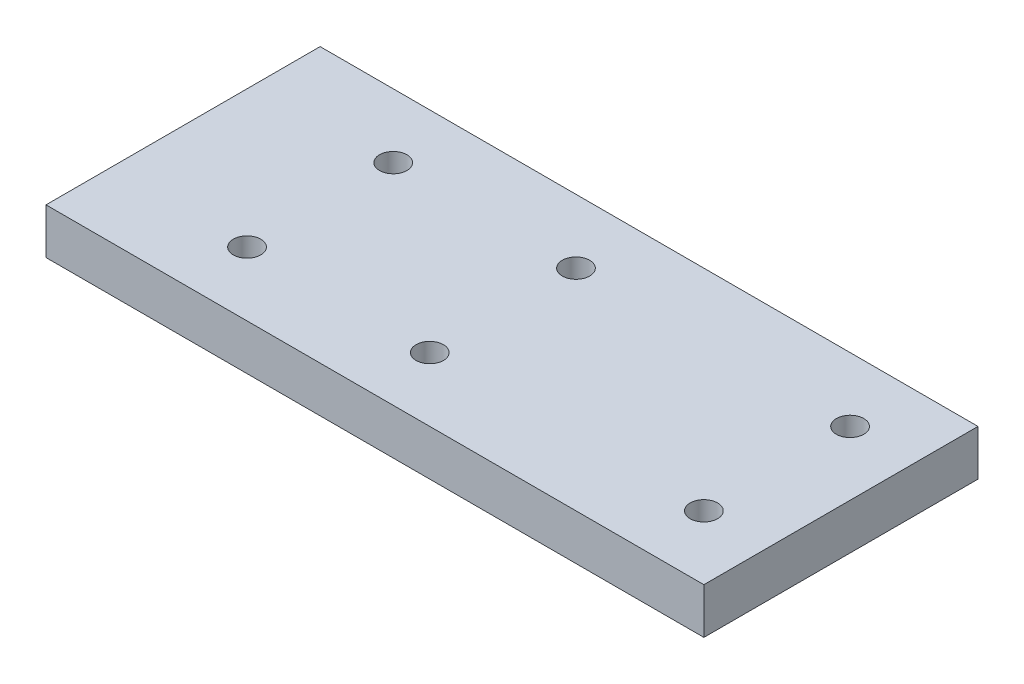
ISO-10303-21;
HEADER;
FILE_DESCRIPTION(('STEP AP214'),'2;1');
FILE_NAME('part.step','',(''),(''),'','','');
FILE_SCHEMA(('AUTOMOTIVE_DESIGN { 1 0 10303 214 1 1 1 1 }'));
ENDSEC;
DATA;
#1=APPLICATION_CONTEXT('core data for automotive mechanical design processes');
#2=APPLICATION_PROTOCOL_DEFINITION('international standard','automotive_design',2000,#1);
#3=PRODUCT_CONTEXT('',#1,'mechanical');
#4=PRODUCT('Part','Part','',(#3));
#5=PRODUCT_RELATED_PRODUCT_CATEGORY('part','',(#4));
#6=PRODUCT_DEFINITION_FORMATION('','',#4);
#7=PRODUCT_DEFINITION_CONTEXT('part definition',#1,'design');
#8=PRODUCT_DEFINITION('design','',#6,#7);
#9=PRODUCT_DEFINITION_SHAPE('','',#8);
#10=(LENGTH_UNIT() NAMED_UNIT(*) SI_UNIT(.MILLI.,.METRE.));
#11=(NAMED_UNIT(*) PLANE_ANGLE_UNIT() SI_UNIT($,.RADIAN.));
#12=(NAMED_UNIT(*) SI_UNIT($,.STERADIAN.) SOLID_ANGLE_UNIT());
#13=UNCERTAINTY_MEASURE_WITH_UNIT(LENGTH_MEASURE(1.E-05),#10,'distance_accuracy_value','');
#14=(GEOMETRIC_REPRESENTATION_CONTEXT(3) GLOBAL_UNCERTAINTY_ASSIGNED_CONTEXT((#13)) GLOBAL_UNIT_ASSIGNED_CONTEXT((#10,
#11,#12)) REPRESENTATION_CONTEXT('',''));
#15=CARTESIAN_POINT('',(0.,0.,0.));
#16=DIRECTION('',(0.,0.,1.));
#17=DIRECTION('',(1.,0.,0.));
#18=AXIS2_PLACEMENT_3D('',#15,#16,#17);
#19=CARTESIAN_POINT('',(57.,5.,0.));
#20=DIRECTION('',(1.,0.,0.));
#21=DIRECTION('',(0.,0.,-1.));
#22=AXIS2_PLACEMENT_3D('',#19,#20,#21);
#23=PLANE('',#22);
#24=DIRECTION('',(0.,0.,1.));
#25=VECTOR('',#24,1.);
#26=CARTESIAN_POINT('',(57.,0.,0.));
#27=LINE('',#26,#25);
#28=CARTESIAN_POINT('',(57.,0.,-15.));
#29=VERTEX_POINT('',#28);
#30=CARTESIAN_POINT('',(57.,0.,15.));
#31=VERTEX_POINT('',#30);
#32=EDGE_CURVE('E123',#29,#31,#27,.T.);
#33=ORIENTED_EDGE('',*,*,#32,.F.);
#34=DIRECTION('',(0.,-1.,0.));
#35=VECTOR('',#34,1.);
#36=CARTESIAN_POINT('',(57.,5.,-15.));
#37=LINE('',#36,#35);
#38=CARTESIAN_POINT('',(57.,5.,-15.));
#39=VERTEX_POINT('',#38);
#40=EDGE_CURVE('E11',#39,#29,#37,.T.);
#41=ORIENTED_EDGE('',*,*,#40,.F.);
#42=DIRECTION('',(0.,0.,1.));
#43=VECTOR('',#42,1.);
#44=CARTESIAN_POINT('',(57.,5.,0.));
#45=LINE('',#44,#43);
#46=CARTESIAN_POINT('',(57.,5.,15.));
#47=VERTEX_POINT('',#46);
#48=EDGE_CURVE('E98',#39,#47,#45,.T.);
#49=ORIENTED_EDGE('',*,*,#48,.T.);
#50=DIRECTION('',(0.,-1.,0.));
#51=VECTOR('',#50,1.);
#52=CARTESIAN_POINT('',(57.,5.,15.));
#53=LINE('',#52,#51);
#54=EDGE_CURVE('E76',#47,#31,#53,.T.);
#55=ORIENTED_EDGE('',*,*,#54,.T.);
#56=EDGE_LOOP('',(#33,#41,#49,#55));
#57=FACE_BOUND('',#56,.T.);
#58=ADVANCED_FACE('F36',(#57),#23,.T.);
#59=CARTESIAN_POINT('',(0.,5.,-15.));
#60=DIRECTION('',(0.,0.,-1.));
#61=DIRECTION('',(-1.,0.,0.));
#62=AXIS2_PLACEMENT_3D('',#59,#60,#61);
#63=PLANE('',#62);
#64=DIRECTION('',(1.,0.,0.));
#65=VECTOR('',#64,1.);
#66=CARTESIAN_POINT('',(0.,0.,-15.));
#67=LINE('',#66,#65);
#68=CARTESIAN_POINT('',(-15.,0.,-15.));
#69=VERTEX_POINT('',#68);
#70=EDGE_CURVE('E88',#69,#29,#67,.T.);
#71=ORIENTED_EDGE('',*,*,#70,.F.);
#72=DIRECTION('',(0.,-1.,0.));
#73=VECTOR('',#72,1.);
#74=CARTESIAN_POINT('',(-15.,5.,-15.));
#75=LINE('',#74,#73);
#76=CARTESIAN_POINT('',(-15.,5.,-15.));
#77=VERTEX_POINT('',#76);
#78=EDGE_CURVE('E45',#77,#69,#75,.T.);
#79=ORIENTED_EDGE('',*,*,#78,.F.);
#80=DIRECTION('',(1.,0.,0.));
#81=VECTOR('',#80,1.);
#82=CARTESIAN_POINT('',(0.,5.,-15.));
#83=LINE('',#82,#81);
#84=EDGE_CURVE('E86',#77,#39,#83,.T.);
#85=ORIENTED_EDGE('',*,*,#84,.T.);
#86=ORIENTED_EDGE('',*,*,#40,.T.);
#87=EDGE_LOOP('',(#71,#79,#85,#86));
#88=FACE_BOUND('',#87,.T.);
#89=ADVANCED_FACE('F84',(#88),#63,.T.);
#90=CARTESIAN_POINT('',(-15.,5.,0.));
#91=DIRECTION('',(1.,0.,0.));
#92=DIRECTION('',(0.,0.,-1.));
#93=AXIS2_PLACEMENT_3D('',#90,#91,#92);
#94=PLANE('',#93);
#95=DIRECTION('',(0.,0.,1.));
#96=VECTOR('',#95,1.);
#97=CARTESIAN_POINT('',(-15.,0.,0.));
#98=LINE('',#97,#96);
#99=CARTESIAN_POINT('',(-15.,0.,15.));
#100=VERTEX_POINT('',#99);
#101=EDGE_CURVE('E126',#69,#100,#98,.T.);
#102=ORIENTED_EDGE('',*,*,#101,.T.);
#103=DIRECTION('',(0.,-1.,0.));
#104=VECTOR('',#103,1.);
#105=CARTESIAN_POINT('',(-15.,5.,15.));
#106=LINE('',#105,#104);
#107=CARTESIAN_POINT('',(-15.,5.,15.));
#108=VERTEX_POINT('',#107);
#109=EDGE_CURVE('E91',#108,#100,#106,.T.);
#110=ORIENTED_EDGE('',*,*,#109,.F.);
#111=DIRECTION('',(0.,0.,1.));
#112=VECTOR('',#111,1.);
#113=CARTESIAN_POINT('',(-15.,5.,0.));
#114=LINE('',#113,#112);
#115=EDGE_CURVE('E93',#77,#108,#114,.T.);
#116=ORIENTED_EDGE('',*,*,#115,.F.);
#117=ORIENTED_EDGE('',*,*,#78,.T.);
#118=EDGE_LOOP('',(#102,#110,#116,#117));
#119=FACE_BOUND('',#118,.T.);
#120=ADVANCED_FACE('F94',(#119),#94,.F.);
#121=CARTESIAN_POINT('',(50.,5.,8.));
#122=DIRECTION('',(0.,-1.,0.));
#123=DIRECTION('',(0.,0.,-1.));
#124=AXIS2_PLACEMENT_3D('',#121,#122,#123);
#125=CYLINDRICAL_SURFACE('',#124,1.5);
#126=CARTESIAN_POINT('',(50.,5.,8.));
#127=DIRECTION('',(0.,1.,0.));
#128=DIRECTION('',(0.,0.,1.));
#129=AXIS2_PLACEMENT_3D('',#126,#127,#128);
#130=CIRCLE('',#129,1.5);
#131=CARTESIAN_POINT('',(50.,5.,9.50000000000001));
#132=VERTEX_POINT('',#131);
#133=EDGE_CURVE('E114',#132,#132,#130,.F.);
#134=ORIENTED_EDGE('',*,*,#133,.F.);
#135=EDGE_LOOP('',(#134));
#136=FACE_BOUND('',#135,.T.);
#137=CARTESIAN_POINT('',(50.,0.,8.));
#138=DIRECTION('',(0.,1.,0.));
#139=DIRECTION('',(0.,0.,1.));
#140=AXIS2_PLACEMENT_3D('',#137,#138,#139);
#141=CIRCLE('',#140,1.5);
#142=CARTESIAN_POINT('',(50.,0.,9.50000000000001));
#143=VERTEX_POINT('',#142);
#144=EDGE_CURVE('E138',#143,#143,#141,.F.);
#145=ORIENTED_EDGE('',*,*,#144,.T.);
#146=EDGE_LOOP('',(#145));
#147=FACE_BOUND('',#146,.T.);
#148=ADVANCED_FACE('F157',(#136,#147),#125,.F.);
#149=CARTESIAN_POINT('',(50.,5.,-8.));
#150=DIRECTION('',(0.,-1.,0.));
#151=DIRECTION('',(0.,0.,-1.));
#152=AXIS2_PLACEMENT_3D('',#149,#150,#151);
#153=CYLINDRICAL_SURFACE('',#152,1.5);
#154=CARTESIAN_POINT('',(50.,5.,-8.));
#155=DIRECTION('',(0.,1.,0.));
#156=DIRECTION('',(0.,0.,1.));
#157=AXIS2_PLACEMENT_3D('',#154,#155,#156);
#158=CIRCLE('',#157,1.5);
#159=CARTESIAN_POINT('',(50.,5.,-6.5));
#160=VERTEX_POINT('',#159);
#161=EDGE_CURVE('E111',#160,#160,#158,.T.);
#162=ORIENTED_EDGE('',*,*,#161,.T.);
#163=EDGE_LOOP('',(#162));
#164=FACE_BOUND('',#163,.T.);
#165=CARTESIAN_POINT('',(50.,0.,-8.));
#166=DIRECTION('',(0.,1.,0.));
#167=DIRECTION('',(0.,0.,1.));
#168=AXIS2_PLACEMENT_3D('',#165,#166,#167);
#169=CIRCLE('',#168,1.5);
#170=CARTESIAN_POINT('',(50.,0.,-6.5));
#171=VERTEX_POINT('',#170);
#172=EDGE_CURVE('E135',#171,#171,#169,.T.);
#173=ORIENTED_EDGE('',*,*,#172,.F.);
#174=EDGE_LOOP('',(#173));
#175=FACE_BOUND('',#174,.T.);
#176=ADVANCED_FACE('F167',(#164,#175),#153,.F.);
#177=CARTESIAN_POINT('',(20.,5.,-8.));
#178=DIRECTION('',(0.,-1.,0.));
#179=DIRECTION('',(0.,0.,-1.));
#180=AXIS2_PLACEMENT_3D('',#177,#178,#179);
#181=CYLINDRICAL_SURFACE('',#180,1.5);
#182=CARTESIAN_POINT('',(20.,5.,-8.));
#183=DIRECTION('',(0.,1.,0.));
#184=DIRECTION('',(0.,0.,1.));
#185=AXIS2_PLACEMENT_3D('',#182,#183,#184);
#186=CIRCLE('',#185,1.5);
#187=CARTESIAN_POINT('',(20.,5.,-6.5));
#188=VERTEX_POINT('',#187);
#189=EDGE_CURVE('E108',#188,#188,#186,.T.);
#190=ORIENTED_EDGE('',*,*,#189,.T.);
#191=EDGE_LOOP('',(#190));
#192=FACE_BOUND('',#191,.T.);
#193=CARTESIAN_POINT('',(20.,0.,-8.));
#194=DIRECTION('',(0.,1.,0.));
#195=DIRECTION('',(0.,0.,1.));
#196=AXIS2_PLACEMENT_3D('',#193,#194,#195);
#197=CIRCLE('',#196,1.5);
#198=CARTESIAN_POINT('',(20.,0.,-6.5));
#199=VERTEX_POINT('',#198);
#200=EDGE_CURVE('E132',#199,#199,#197,.T.);
#201=ORIENTED_EDGE('',*,*,#200,.F.);
#202=EDGE_LOOP('',(#201));
#203=FACE_BOUND('',#202,.T.);
#204=ADVANCED_FACE('F163',(#192,#203),#181,.F.);
#205=CARTESIAN_POINT('',(0.,5.,-8.));
#206=DIRECTION('',(0.,-1.,0.));
#207=DIRECTION('',(0.,0.,-1.));
#208=AXIS2_PLACEMENT_3D('',#205,#206,#207);
#209=CYLINDRICAL_SURFACE('',#208,1.5);
#210=CARTESIAN_POINT('',(0.,5.,-8.));
#211=DIRECTION('',(0.,1.,0.));
#212=DIRECTION('',(0.,0.,1.));
#213=AXIS2_PLACEMENT_3D('',#210,#211,#212);
#214=CIRCLE('',#213,1.5);
#215=CARTESIAN_POINT('',(0.,5.,-6.5));
#216=VERTEX_POINT('',#215);
#217=EDGE_CURVE('E105',#216,#216,#214,.T.);
#218=ORIENTED_EDGE('',*,*,#217,.T.);
#219=EDGE_LOOP('',(#218));
#220=FACE_BOUND('',#219,.T.);
#221=CARTESIAN_POINT('',(0.,0.,-8.));
#222=DIRECTION('',(0.,1.,0.));
#223=DIRECTION('',(0.,0.,1.));
#224=AXIS2_PLACEMENT_3D('',#221,#222,#223);
#225=CIRCLE('',#224,1.5);
#226=CARTESIAN_POINT('',(0.,0.,-6.5));
#227=VERTEX_POINT('',#226);
#228=EDGE_CURVE('E129',#227,#227,#225,.T.);
#229=ORIENTED_EDGE('',*,*,#228,.F.);
#230=EDGE_LOOP('',(#229));
#231=FACE_BOUND('',#230,.T.);
#232=ADVANCED_FACE('F160',(#220,#231),#209,.F.);
#233=CARTESIAN_POINT('',(0.,5.,15.));
#234=DIRECTION('',(0.,0.,-1.));
#235=DIRECTION('',(-1.,0.,0.));
#236=AXIS2_PLACEMENT_3D('',#233,#234,#235);
#237=PLANE('',#236);
#238=DIRECTION('',(1.,0.,0.));
#239=VECTOR('',#238,1.);
#240=CARTESIAN_POINT('',(0.,0.,15.));
#241=LINE('',#240,#239);
#242=EDGE_CURVE('E69',#100,#31,#241,.T.);
#243=ORIENTED_EDGE('',*,*,#242,.T.);
#244=ORIENTED_EDGE('',*,*,#54,.F.);
#245=DIRECTION('',(1.,0.,0.));
#246=VECTOR('',#245,1.);
#247=CARTESIAN_POINT('',(0.,5.,15.));
#248=LINE('',#247,#246);
#249=EDGE_CURVE('E53',#108,#47,#248,.T.);
#250=ORIENTED_EDGE('',*,*,#249,.F.);
#251=ORIENTED_EDGE('',*,*,#109,.T.);
#252=EDGE_LOOP('',(#243,#244,#250,#251));
#253=FACE_BOUND('',#252,.T.);
#254=ADVANCED_FACE('F146',(#253),#237,.F.);
#255=CARTESIAN_POINT('',(20.,5.,8.));
#256=DIRECTION('',(0.,-1.,0.));
#257=DIRECTION('',(0.,0.,-1.));
#258=AXIS2_PLACEMENT_3D('',#255,#256,#257);
#259=CYLINDRICAL_SURFACE('',#258,1.5);
#260=CARTESIAN_POINT('',(20.,5.,8.));
#261=DIRECTION('',(0.,1.,0.));
#262=DIRECTION('',(0.,0.,1.));
#263=AXIS2_PLACEMENT_3D('',#260,#261,#262);
#264=CIRCLE('',#263,1.5);
#265=CARTESIAN_POINT('',(20.,5.,9.5));
#266=VERTEX_POINT('',#265);
#267=EDGE_CURVE('E100',#266,#266,#264,.F.);
#268=ORIENTED_EDGE('',*,*,#267,.F.);
#269=EDGE_LOOP('',(#268));
#270=FACE_BOUND('',#269,.T.);
#271=CARTESIAN_POINT('',(20.,0.,8.));
#272=DIRECTION('',(0.,1.,0.));
#273=DIRECTION('',(0.,0.,1.));
#274=AXIS2_PLACEMENT_3D('',#271,#272,#273);
#275=CIRCLE('',#274,1.5);
#276=CARTESIAN_POINT('',(20.,0.,9.5));
#277=VERTEX_POINT('',#276);
#278=EDGE_CURVE('E120',#277,#277,#275,.F.);
#279=ORIENTED_EDGE('',*,*,#278,.T.);
#280=EDGE_LOOP('',(#279));
#281=FACE_BOUND('',#280,.T.);
#282=ADVANCED_FACE('F38',(#270,#281),#259,.F.);
#283=CARTESIAN_POINT('',(0.,5.,8.));
#284=DIRECTION('',(0.,-1.,0.));
#285=DIRECTION('',(0.,0.,-1.));
#286=AXIS2_PLACEMENT_3D('',#283,#284,#285);
#287=CYLINDRICAL_SURFACE('',#286,1.5);
#288=CARTESIAN_POINT('',(0.,5.,8.));
#289=DIRECTION('',(0.,1.,0.));
#290=DIRECTION('',(0.,0.,1.));
#291=AXIS2_PLACEMENT_3D('',#288,#289,#290);
#292=CIRCLE('',#291,1.5);
#293=CARTESIAN_POINT('',(0.,5.,9.5));
#294=VERTEX_POINT('',#293);
#295=EDGE_CURVE('E117',#294,#294,#292,.F.);
#296=ORIENTED_EDGE('',*,*,#295,.F.);
#297=EDGE_LOOP('',(#296));
#298=FACE_BOUND('',#297,.T.);
#299=CARTESIAN_POINT('',(0.,0.,8.));
#300=DIRECTION('',(0.,1.,0.));
#301=DIRECTION('',(0.,0.,1.));
#302=AXIS2_PLACEMENT_3D('',#299,#300,#301);
#303=CIRCLE('',#302,1.5);
#304=CARTESIAN_POINT('',(0.,0.,9.5));
#305=VERTEX_POINT('',#304);
#306=EDGE_CURVE('E141',#305,#305,#303,.F.);
#307=ORIENTED_EDGE('',*,*,#306,.T.);
#308=EDGE_LOOP('',(#307));
#309=FACE_BOUND('',#308,.T.);
#310=ADVANCED_FACE('F175',(#298,#309),#287,.F.);
#311=CARTESIAN_POINT('',(0.,5.,0.));
#312=DIRECTION('',(0.,1.,0.));
#313=DIRECTION('',(0.,0.,1.));
#314=AXIS2_PLACEMENT_3D('',#311,#312,#313);
#315=PLANE('',#314);
#316=ORIENTED_EDGE('',*,*,#267,.T.);
#317=EDGE_LOOP('',(#316));
#318=FACE_BOUND('',#317,.T.);
#319=ORIENTED_EDGE('',*,*,#48,.F.);
#320=ORIENTED_EDGE('',*,*,#84,.F.);
#321=ORIENTED_EDGE('',*,*,#115,.T.);
#322=ORIENTED_EDGE('',*,*,#249,.T.);
#323=EDGE_LOOP('',(#319,#320,#321,#322));
#324=FACE_BOUND('',#323,.T.);
#325=ORIENTED_EDGE('',*,*,#217,.F.);
#326=EDGE_LOOP('',(#325));
#327=FACE_BOUND('',#326,.T.);
#328=ORIENTED_EDGE('',*,*,#189,.F.);
#329=EDGE_LOOP('',(#328));
#330=FACE_BOUND('',#329,.T.);
#331=ORIENTED_EDGE('',*,*,#161,.F.);
#332=EDGE_LOOP('',(#331));
#333=FACE_BOUND('',#332,.T.);
#334=ORIENTED_EDGE('',*,*,#133,.T.);
#335=EDGE_LOOP('',(#334));
#336=FACE_BOUND('',#335,.T.);
#337=ORIENTED_EDGE('',*,*,#295,.T.);
#338=EDGE_LOOP('',(#337));
#339=FACE_BOUND('',#338,.T.);
#340=ADVANCED_FACE('F96',(#318,#324,#327,#330,#333,#336,#339),#315,.T.);
#341=CARTESIAN_POINT('',(0.,0.,0.));
#342=DIRECTION('',(0.,1.,0.));
#343=DIRECTION('',(0.,0.,1.));
#344=AXIS2_PLACEMENT_3D('',#341,#342,#343);
#345=PLANE('',#344);
#346=ORIENTED_EDGE('',*,*,#278,.F.);
#347=EDGE_LOOP('',(#346));
#348=FACE_BOUND('',#347,.T.);
#349=ORIENTED_EDGE('',*,*,#32,.T.);
#350=ORIENTED_EDGE('',*,*,#242,.F.);
#351=ORIENTED_EDGE('',*,*,#101,.F.);
#352=ORIENTED_EDGE('',*,*,#70,.T.);
#353=EDGE_LOOP('',(#349,#350,#351,#352));
#354=FACE_BOUND('',#353,.T.);
#355=ORIENTED_EDGE('',*,*,#228,.T.);
#356=EDGE_LOOP('',(#355));
#357=FACE_BOUND('',#356,.T.);
#358=ORIENTED_EDGE('',*,*,#200,.T.);
#359=EDGE_LOOP('',(#358));
#360=FACE_BOUND('',#359,.T.);
#361=ORIENTED_EDGE('',*,*,#172,.T.);
#362=EDGE_LOOP('',(#361));
#363=FACE_BOUND('',#362,.T.);
#364=ORIENTED_EDGE('',*,*,#144,.F.);
#365=EDGE_LOOP('',(#364));
#366=FACE_BOUND('',#365,.T.);
#367=ORIENTED_EDGE('',*,*,#306,.F.);
#368=EDGE_LOOP('',(#367));
#369=FACE_BOUND('',#368,.T.);
#370=ADVANCED_FACE('F147',(#348,#354,#357,#360,#363,#366,#369),#345,.F.);
#371=CLOSED_SHELL('',(#58,#89,#120,#148,#176,#204,#232,#254,#282,#310,#340,#370));
#372=MANIFOLD_SOLID_BREP('B2',#371);
#373=ADVANCED_BREP_SHAPE_REPRESENTATION('',(#18,#372),#14);
#374=SHAPE_DEFINITION_REPRESENTATION(#9,#373);
ENDSEC;
END-ISO-10303-21;
